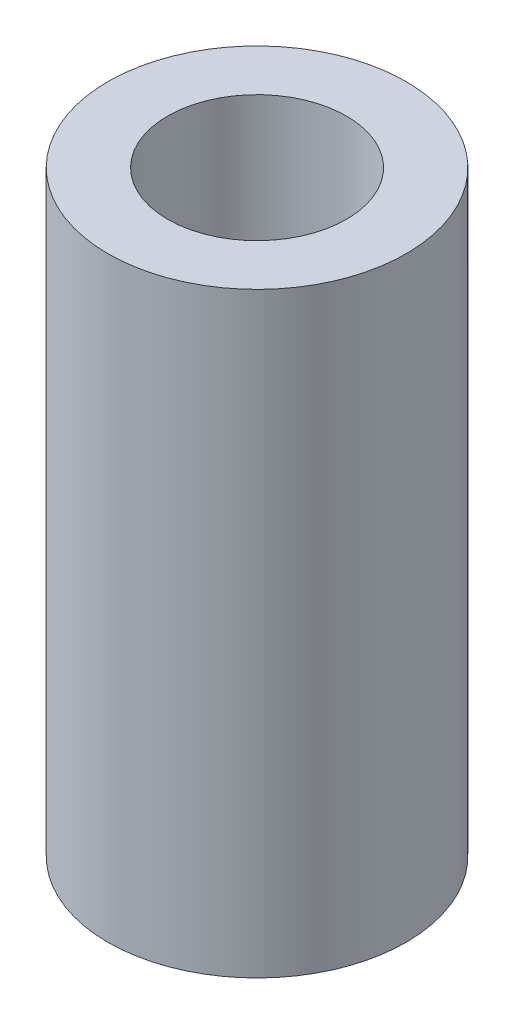
ISO-10303-21;
HEADER;
FILE_DESCRIPTION(('STEP AP214'),'2;1');
FILE_NAME('part.step','',(''),(''),'','','');
FILE_SCHEMA(('AUTOMOTIVE_DESIGN { 1 0 10303 214 1 1 1 1 }'));
ENDSEC;
DATA;
#1=APPLICATION_CONTEXT('core data for automotive mechanical design processes');
#2=APPLICATION_PROTOCOL_DEFINITION('international standard','automotive_design',2000,#1);
#3=PRODUCT_CONTEXT('',#1,'mechanical');
#4=PRODUCT('Part','Part','',(#3));
#5=PRODUCT_RELATED_PRODUCT_CATEGORY('part','',(#4));
#6=PRODUCT_DEFINITION_FORMATION('','',#4);
#7=PRODUCT_DEFINITION_CONTEXT('part definition',#1,'design');
#8=PRODUCT_DEFINITION('design','',#6,#7);
#9=PRODUCT_DEFINITION_SHAPE('','',#8);
#10=(LENGTH_UNIT() NAMED_UNIT(*) SI_UNIT(.MILLI.,.METRE.));
#11=(NAMED_UNIT(*) PLANE_ANGLE_UNIT() SI_UNIT($,.RADIAN.));
#12=(NAMED_UNIT(*) SI_UNIT($,.STERADIAN.) SOLID_ANGLE_UNIT());
#13=UNCERTAINTY_MEASURE_WITH_UNIT(LENGTH_MEASURE(1.E-05),#10,'distance_accuracy_value','');
#14=(GEOMETRIC_REPRESENTATION_CONTEXT(3) GLOBAL_UNCERTAINTY_ASSIGNED_CONTEXT((#13)) GLOBAL_UNIT_ASSIGNED_CONTEXT((#10,
#11,#12)) REPRESENTATION_CONTEXT('',''));
#15=CARTESIAN_POINT('',(0.,0.,0.));
#16=DIRECTION('',(0.,0.,1.));
#17=DIRECTION('',(1.,0.,0.));
#18=AXIS2_PLACEMENT_3D('',#15,#16,#17);
#19=CARTESIAN_POINT('',(0.,20.,0.));
#20=DIRECTION('',(0.,1.,0.));
#21=DIRECTION('',(0.,0.,1.));
#22=AXIS2_PLACEMENT_3D('',#19,#20,#21);
#23=PLANE('',#22);
#24=CARTESIAN_POINT('',(0.,20.,0.));
#25=DIRECTION('',(0.,1.,0.));
#26=DIRECTION('',(0.,0.,1.));
#27=AXIS2_PLACEMENT_3D('',#24,#25,#26);
#28=CIRCLE('',#27,5.);
#29=CARTESIAN_POINT('',(0.,20.,5.));
#30=VERTEX_POINT('',#29);
#31=EDGE_CURVE('E10',#30,#30,#28,.T.);
#32=ORIENTED_EDGE('',*,*,#31,.T.);
#33=EDGE_LOOP('',(#32));
#34=FACE_BOUND('',#33,.T.);
#35=CARTESIAN_POINT('',(0.,20.,0.));
#36=DIRECTION('',(0.,1.,0.));
#37=DIRECTION('',(0.,0.,1.));
#38=AXIS2_PLACEMENT_3D('',#35,#36,#37);
#39=CIRCLE('',#38,3.);
#40=CARTESIAN_POINT('',(0.,20.,3.));
#41=VERTEX_POINT('',#40);
#42=EDGE_CURVE('E42',#41,#41,#39,.T.);
#43=ORIENTED_EDGE('',*,*,#42,.F.);
#44=EDGE_LOOP('',(#43));
#45=FACE_BOUND('',#44,.T.);
#46=ADVANCED_FACE('F31',(#34,#45),#23,.T.);
#47=CARTESIAN_POINT('',(0.,0.,0.));
#48=DIRECTION('',(0.,1.,0.));
#49=DIRECTION('',(0.,0.,1.));
#50=AXIS2_PLACEMENT_3D('',#47,#48,#49);
#51=PLANE('',#50);
#52=CARTESIAN_POINT('',(0.,0.,0.));
#53=DIRECTION('',(0.,1.,0.));
#54=DIRECTION('',(0.,0.,1.));
#55=AXIS2_PLACEMENT_3D('',#52,#53,#54);
#56=CIRCLE('',#55,5.);
#57=CARTESIAN_POINT('',(0.,0.,5.));
#58=VERTEX_POINT('',#57);
#59=EDGE_CURVE('E35',#58,#58,#56,.T.);
#60=ORIENTED_EDGE('',*,*,#59,.F.);
#61=EDGE_LOOP('',(#60));
#62=FACE_BOUND('',#61,.T.);
#63=CARTESIAN_POINT('',(0.,0.,0.));
#64=DIRECTION('',(0.,1.,0.));
#65=DIRECTION('',(0.,0.,1.));
#66=AXIS2_PLACEMENT_3D('',#63,#64,#65);
#67=CIRCLE('',#66,3.);
#68=CARTESIAN_POINT('',(0.,0.,3.));
#69=VERTEX_POINT('',#68);
#70=EDGE_CURVE('E44',#69,#69,#67,.T.);
#71=ORIENTED_EDGE('',*,*,#70,.T.);
#72=EDGE_LOOP('',(#71));
#73=FACE_BOUND('',#72,.T.);
#74=ADVANCED_FACE('F54',(#62,#73),#51,.F.);
#75=CARTESIAN_POINT('',(0.,20.,0.));
#76=DIRECTION('',(0.,-1.,0.));
#77=DIRECTION('',(0.,0.,-1.));
#78=AXIS2_PLACEMENT_3D('',#75,#76,#77);
#79=CYLINDRICAL_SURFACE('',#78,5.);
#80=ORIENTED_EDGE('',*,*,#31,.F.);
#81=EDGE_LOOP('',(#80));
#82=FACE_BOUND('',#81,.T.);
#83=ORIENTED_EDGE('',*,*,#59,.T.);
#84=EDGE_LOOP('',(#83));
#85=FACE_BOUND('',#84,.T.);
#86=ADVANCED_FACE('F33',(#82,#85),#79,.T.);
#87=CARTESIAN_POINT('',(0.,20.,0.));
#88=DIRECTION('',(0.,-1.,0.));
#89=DIRECTION('',(0.,0.,-1.));
#90=AXIS2_PLACEMENT_3D('',#87,#88,#89);
#91=CYLINDRICAL_SURFACE('',#90,3.);
#92=ORIENTED_EDGE('',*,*,#42,.T.);
#93=EDGE_LOOP('',(#92));
#94=FACE_BOUND('',#93,.T.);
#95=ORIENTED_EDGE('',*,*,#70,.F.);
#96=EDGE_LOOP('',(#95));
#97=FACE_BOUND('',#96,.T.);
#98=ADVANCED_FACE('F50',(#94,#97),#91,.F.);
#99=CLOSED_SHELL('',(#46,#74,#86,#98));
#100=MANIFOLD_SOLID_BREP('B2',#99);
#101=ADVANCED_BREP_SHAPE_REPRESENTATION('',(#18,#100),#14);
#102=SHAPE_DEFINITION_REPRESENTATION(#9,#101);
ENDSEC;
END-ISO-10303-21;
